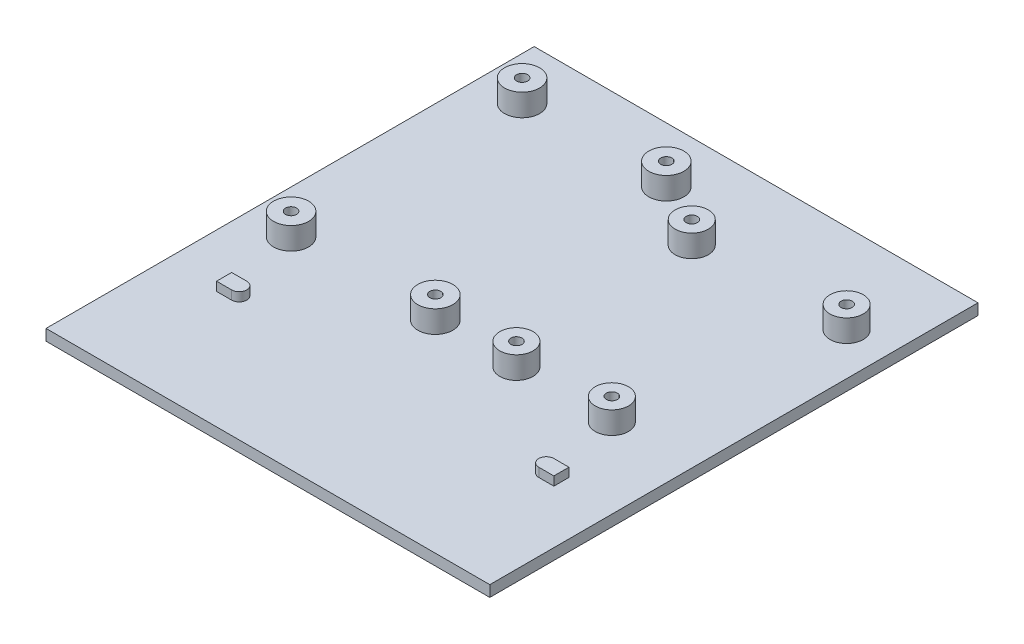
ISO-10303-21;
HEADER;
FILE_DESCRIPTION(('STEP AP214'),'2;1');
FILE_NAME('part.step','',(''),(''),'','','');
FILE_SCHEMA(('AUTOMOTIVE_DESIGN { 1 0 10303 214 1 1 1 1 }'));
ENDSEC;
DATA;
#1=APPLICATION_CONTEXT('core data for automotive mechanical design processes');
#2=APPLICATION_PROTOCOL_DEFINITION('international standard','automotive_design',2000,#1);
#3=PRODUCT_CONTEXT('',#1,'mechanical');
#4=PRODUCT('Part','Part','',(#3));
#5=PRODUCT_RELATED_PRODUCT_CATEGORY('part','',(#4));
#6=PRODUCT_DEFINITION_FORMATION('','',#4);
#7=PRODUCT_DEFINITION_CONTEXT('part definition',#1,'design');
#8=PRODUCT_DEFINITION('design','',#6,#7);
#9=PRODUCT_DEFINITION_SHAPE('','',#8);
#10=(LENGTH_UNIT() NAMED_UNIT(*) SI_UNIT(.MILLI.,.METRE.));
#11=(NAMED_UNIT(*) PLANE_ANGLE_UNIT() SI_UNIT($,.RADIAN.));
#12=(NAMED_UNIT(*) SI_UNIT($,.STERADIAN.) SOLID_ANGLE_UNIT());
#13=UNCERTAINTY_MEASURE_WITH_UNIT(LENGTH_MEASURE(1.E-05),#10,'distance_accuracy_value','');
#14=(GEOMETRIC_REPRESENTATION_CONTEXT(3) GLOBAL_UNCERTAINTY_ASSIGNED_CONTEXT((#13)) GLOBAL_UNIT_ASSIGNED_CONTEXT((#10,
#11,#12)) REPRESENTATION_CONTEXT('',''));
#15=CARTESIAN_POINT('',(0.,0.,0.));
#16=DIRECTION('',(0.,0.,1.));
#17=DIRECTION('',(1.,0.,0.));
#18=AXIS2_PLACEMENT_3D('',#15,#16,#17);
#19=CARTESIAN_POINT('',(15.24,9.525,106.1339));
#20=DIRECTION('',(0.,0.,-1.));
#21=DIRECTION('',(-1.,0.,0.));
#22=AXIS2_PLACEMENT_3D('',#19,#20,#21);
#23=PLANE('',#22);
#24=DIRECTION('',(1.,0.,0.));
#25=VECTOR('',#24,1.);
#26=CARTESIAN_POINT('',(15.24,5.715,106.1339));
#27=LINE('',#26,#25);
#28=CARTESIAN_POINT('',(15.24,5.715,106.1339));
#29=VERTEX_POINT('',#28);
#30=CARTESIAN_POINT('',(19.558,5.715,106.1339));
#31=VERTEX_POINT('',#30);
#32=EDGE_CURVE('E127',#29,#31,#27,.T.);
#33=ORIENTED_EDGE('',*,*,#32,.F.);
#34=DIRECTION('',(0.,-1.,0.));
#35=VECTOR('',#34,1.);
#36=CARTESIAN_POINT('',(15.24,9.525,106.1339));
#37=LINE('',#36,#35);
#38=CARTESIAN_POINT('',(15.24,3.175,106.1339));
#39=VERTEX_POINT('',#38);
#40=EDGE_CURVE('E150',#29,#39,#37,.T.);
#41=ORIENTED_EDGE('',*,*,#40,.T.);
#42=DIRECTION('',(1.,0.,0.));
#43=VECTOR('',#42,1.);
#44=CARTESIAN_POINT('',(15.24,3.175,106.1339));
#45=LINE('',#44,#43);
#46=CARTESIAN_POINT('',(19.558,3.175,106.1339));
#47=VERTEX_POINT('',#46);
#48=EDGE_CURVE('E446',#39,#47,#45,.T.);
#49=ORIENTED_EDGE('',*,*,#48,.T.);
#50=DIRECTION('',(0.,-1.,0.));
#51=VECTOR('',#50,1.);
#52=CARTESIAN_POINT('',(19.558,9.525,106.1339));
#53=LINE('',#52,#51);
#54=EDGE_CURVE('E146',#31,#47,#53,.T.);
#55=ORIENTED_EDGE('',*,*,#54,.F.);
#56=EDGE_LOOP('',(#33,#41,#49,#55));
#57=FACE_BOUND('',#56,.T.);
#58=ADVANCED_FACE('F37',(#57),#23,.F.);
#59=CARTESIAN_POINT('',(19.558,9.525,103.9749));
#60=DIRECTION('',(0.,-1.,0.));
#61=DIRECTION('',(0.,0.,-1.));
#62=AXIS2_PLACEMENT_3D('',#59,#60,#61);
#63=CYLINDRICAL_SURFACE('',#62,2.159);
#64=CARTESIAN_POINT('',(19.558,5.715,103.9749));
#65=DIRECTION('',(0.,1.,0.));
#66=DIRECTION('',(0.,0.,1.));
#67=AXIS2_PLACEMENT_3D('',#64,#65,#66);
#68=CIRCLE('',#67,2.159);
#69=CARTESIAN_POINT('',(19.558,5.715,101.8159));
#70=VERTEX_POINT('',#69);
#71=EDGE_CURVE('E124',#31,#70,#68,.T.);
#72=ORIENTED_EDGE('',*,*,#71,.F.);
#73=ORIENTED_EDGE('',*,*,#54,.T.);
#74=CARTESIAN_POINT('',(19.558,3.175,103.9749));
#75=DIRECTION('',(0.,1.,0.));
#76=DIRECTION('',(0.,0.,1.));
#77=AXIS2_PLACEMENT_3D('',#74,#75,#76);
#78=CIRCLE('',#77,2.159);
#79=CARTESIAN_POINT('',(19.558,3.175,101.8159));
#80=VERTEX_POINT('',#79);
#81=EDGE_CURVE('E144',#47,#80,#78,.T.);
#82=ORIENTED_EDGE('',*,*,#81,.T.);
#83=DIRECTION('',(0.,-1.,0.));
#84=VECTOR('',#83,1.);
#85=CARTESIAN_POINT('',(19.558,9.525,101.8159));
#86=LINE('',#85,#84);
#87=EDGE_CURVE('E137',#70,#80,#86,.T.);
#88=ORIENTED_EDGE('',*,*,#87,.F.);
#89=EDGE_LOOP('',(#72,#73,#82,#88));
#90=FACE_BOUND('',#89,.T.);
#91=ADVANCED_FACE('F142',(#90),#63,.T.);
#92=CARTESIAN_POINT('',(15.24,9.525,101.8159));
#93=DIRECTION('',(0.,0.,1.));
#94=DIRECTION('',(1.,0.,0.));
#95=AXIS2_PLACEMENT_3D('',#92,#93,#94);
#96=PLANE('',#95);
#97=DIRECTION('',(-1.,0.,0.));
#98=VECTOR('',#97,1.);
#99=CARTESIAN_POINT('',(19.558,5.715,101.8159));
#100=LINE('',#99,#98);
#101=CARTESIAN_POINT('',(15.24,5.715,101.8159));
#102=VERTEX_POINT('',#101);
#103=EDGE_CURVE('E52',#70,#102,#100,.T.);
#104=ORIENTED_EDGE('',*,*,#103,.F.);
#105=ORIENTED_EDGE('',*,*,#87,.T.);
#106=DIRECTION('',(-1.,0.,0.));
#107=VECTOR('',#106,1.);
#108=CARTESIAN_POINT('',(15.24,3.175,101.8159));
#109=LINE('',#108,#107);
#110=CARTESIAN_POINT('',(15.24,3.175,101.8159));
#111=VERTEX_POINT('',#110);
#112=EDGE_CURVE('E450',#80,#111,#109,.T.);
#113=ORIENTED_EDGE('',*,*,#112,.T.);
#114=DIRECTION('',(0.,-1.,0.));
#115=VECTOR('',#114,1.);
#116=CARTESIAN_POINT('',(15.24,9.525,101.8159));
#117=LINE('',#116,#115);
#118=EDGE_CURVE('E139',#102,#111,#117,.T.);
#119=ORIENTED_EDGE('',*,*,#118,.F.);
#120=EDGE_LOOP('',(#104,#105,#113,#119));
#121=FACE_BOUND('',#120,.T.);
#122=ADVANCED_FACE('F135',(#121),#96,.F.);
#123=CARTESIAN_POINT('',(15.24,9.525,106.1339));
#124=DIRECTION('',(1.,0.,0.));
#125=DIRECTION('',(0.,0.,-1.));
#126=AXIS2_PLACEMENT_3D('',#123,#124,#125);
#127=PLANE('',#126);
#128=DIRECTION('',(0.,0.,1.));
#129=VECTOR('',#128,1.);
#130=CARTESIAN_POINT('',(15.24,5.715,101.8159));
#131=LINE('',#130,#129);
#132=EDGE_CURVE('E140',#102,#29,#131,.T.);
#133=ORIENTED_EDGE('',*,*,#132,.F.);
#134=ORIENTED_EDGE('',*,*,#118,.T.);
#135=DIRECTION('',(0.,0.,1.));
#136=VECTOR('',#135,1.);
#137=CARTESIAN_POINT('',(15.24,3.175,106.1339));
#138=LINE('',#137,#136);
#139=EDGE_CURVE('E452',#111,#39,#138,.T.);
#140=ORIENTED_EDGE('',*,*,#139,.T.);
#141=ORIENTED_EDGE('',*,*,#40,.F.);
#142=EDGE_LOOP('',(#133,#134,#140,#141));
#143=FACE_BOUND('',#142,.T.);
#144=ADVANCED_FACE('F410',(#143),#127,.F.);
#145=CARTESIAN_POINT('',(0.,3.175,0.));
#146=DIRECTION('',(0.,1.,0.));
#147=DIRECTION('',(0.,0.,1.));
#148=AXIS2_PLACEMENT_3D('',#145,#146,#147);
#149=PLANE('',#148);
#150=CARTESIAN_POINT('',(12.3825,3.175,81.94675));
#151=DIRECTION('',(0.,1.,0.));
#152=DIRECTION('',(0.,0.,1.));
#153=AXIS2_PLACEMENT_3D('',#150,#151,#152);
#154=CIRCLE('',#153,5.0165);
#155=CARTESIAN_POINT('',(12.3825,3.175,86.96325));
#156=VERTEX_POINT('',#155);
#157=EDGE_CURVE('E156',#156,#156,#154,.T.);
#158=ORIENTED_EDGE('',*,*,#157,.F.);
#159=EDGE_LOOP('',(#158));
#160=FACE_BOUND('',#159,.T.);
#161=CARTESIAN_POINT('',(53.6575,3.175,81.94675));
#162=DIRECTION('',(0.,1.,0.));
#163=DIRECTION('',(0.,0.,1.));
#164=AXIS2_PLACEMENT_3D('',#161,#162,#163);
#165=CIRCLE('',#164,5.0165);
#166=CARTESIAN_POINT('',(53.6575,3.175,86.96325));
#167=VERTEX_POINT('',#166);
#168=EDGE_CURVE('E165',#167,#167,#165,.T.);
#169=ORIENTED_EDGE('',*,*,#168,.F.);
#170=EDGE_LOOP('',(#169));
#171=FACE_BOUND('',#170,.T.);
#172=CARTESIAN_POINT('',(76.835,3.175,81.915));
#173=DIRECTION('',(0.,1.,0.));
#174=DIRECTION('',(0.,0.,1.));
#175=AXIS2_PLACEMENT_3D('',#172,#173,#174);
#176=CIRCLE('',#175,4.7625);
#177=CARTESIAN_POINT('',(76.835,3.175,86.6775));
#178=VERTEX_POINT('',#177);
#179=EDGE_CURVE('E174',#178,#178,#176,.T.);
#180=ORIENTED_EDGE('',*,*,#179,.F.);
#181=EDGE_LOOP('',(#180));
#182=FACE_BOUND('',#181,.T.);
#183=CARTESIAN_POINT('',(104.14,3.175,81.915));
#184=DIRECTION('',(0.,1.,0.));
#185=DIRECTION('',(0.,0.,1.));
#186=AXIS2_PLACEMENT_3D('',#183,#184,#185);
#187=CIRCLE('',#186,4.7625);
#188=CARTESIAN_POINT('',(104.14,3.175,86.6775));
#189=VERTEX_POINT('',#188);
#190=EDGE_CURVE('E183',#189,#189,#187,.T.);
#191=ORIENTED_EDGE('',*,*,#190,.F.);
#192=EDGE_LOOP('',(#191));
#193=FACE_BOUND('',#192,.T.);
#194=CARTESIAN_POINT('',(114.935,3.175,25.527));
#195=DIRECTION('',(0.,1.,0.));
#196=DIRECTION('',(0.,0.,1.));
#197=AXIS2_PLACEMENT_3D('',#194,#195,#196);
#198=CIRCLE('',#197,4.76250000000001);
#199=CARTESIAN_POINT('',(114.935,3.175,30.2895));
#200=VERTEX_POINT('',#199);
#201=EDGE_CURVE('E192',#200,#200,#198,.T.);
#202=ORIENTED_EDGE('',*,*,#201,.F.);
#203=EDGE_LOOP('',(#202));
#204=FACE_BOUND('',#203,.T.);
#205=CARTESIAN_POINT('',(71.755,3.175,26.67));
#206=DIRECTION('',(0.,1.,0.));
#207=DIRECTION('',(0.,0.,1.));
#208=AXIS2_PLACEMENT_3D('',#205,#206,#207);
#209=CIRCLE('',#208,4.7625);
#210=CARTESIAN_POINT('',(71.755,3.175,31.4325));
#211=VERTEX_POINT('',#210);
#212=EDGE_CURVE('E201',#211,#211,#209,.T.);
#213=ORIENTED_EDGE('',*,*,#212,.F.);
#214=EDGE_LOOP('',(#213));
#215=FACE_BOUND('',#214,.T.);
#216=CARTESIAN_POINT('',(53.6575,3.175,15.84325));
#217=DIRECTION('',(0.,1.,0.));
#218=DIRECTION('',(0.,0.,1.));
#219=AXIS2_PLACEMENT_3D('',#216,#217,#218);
#220=CIRCLE('',#219,5.0165);
#221=CARTESIAN_POINT('',(53.6575,3.175,20.85975));
#222=VERTEX_POINT('',#221);
#223=EDGE_CURVE('E210',#222,#222,#220,.T.);
#224=ORIENTED_EDGE('',*,*,#223,.F.);
#225=EDGE_LOOP('',(#224));
#226=FACE_BOUND('',#225,.T.);
#227=CARTESIAN_POINT('',(12.3825,3.175,15.84325));
#228=DIRECTION('',(0.,1.,0.));
#229=DIRECTION('',(0.,0.,1.));
#230=AXIS2_PLACEMENT_3D('',#227,#228,#229);
#231=CIRCLE('',#230,5.0165);
#232=CARTESIAN_POINT('',(12.3825,3.175,20.85975));
#233=VERTEX_POINT('',#232);
#234=EDGE_CURVE('E219',#233,#233,#231,.T.);
#235=ORIENTED_EDGE('',*,*,#234,.F.);
#236=EDGE_LOOP('',(#235));
#237=FACE_BOUND('',#236,.T.);
#238=DIRECTION('',(0.,0.,1.));
#239=VECTOR('',#238,1.);
#240=CARTESIAN_POINT('',(0.,3.175,0.));
#241=LINE('',#240,#239);
#242=CARTESIAN_POINT('',(0.,3.175,0.));
#243=VERTEX_POINT('',#242);
#244=CARTESIAN_POINT('',(0.,3.175,139.7));
#245=VERTEX_POINT('',#244);
#246=EDGE_CURVE('E226',#243,#245,#241,.T.);
#247=ORIENTED_EDGE('',*,*,#246,.T.);
#248=DIRECTION('',(1.,0.,0.));
#249=VECTOR('',#248,1.);
#250=CARTESIAN_POINT('',(0.,3.175,139.7));
#251=LINE('',#250,#249);
#252=CARTESIAN_POINT('',(127.,3.175,139.7));
#253=VERTEX_POINT('',#252);
#254=EDGE_CURVE('E229',#245,#253,#251,.T.);
#255=ORIENTED_EDGE('',*,*,#254,.T.);
#256=DIRECTION('',(0.,0.,1.));
#257=VECTOR('',#256,1.);
#258=CARTESIAN_POINT('',(127.,3.175,0.));
#259=LINE('',#258,#257);
#260=CARTESIAN_POINT('',(127.,3.175,0.));
#261=VERTEX_POINT('',#260);
#262=EDGE_CURVE('E232',#261,#253,#259,.T.);
#263=ORIENTED_EDGE('',*,*,#262,.F.);
#264=DIRECTION('',(1.,0.,0.));
#265=VECTOR('',#264,1.);
#266=CARTESIAN_POINT('',(0.,3.175,0.));
#267=LINE('',#266,#265);
#268=EDGE_CURVE('E235',#243,#261,#267,.T.);
#269=ORIENTED_EDGE('',*,*,#268,.F.);
#270=EDGE_LOOP('',(#247,#255,#263,#269));
#271=FACE_BOUND('',#270,.T.);
#272=ORIENTED_EDGE('',*,*,#81,.F.);
#273=ORIENTED_EDGE('',*,*,#48,.F.);
#274=ORIENTED_EDGE('',*,*,#139,.F.);
#275=ORIENTED_EDGE('',*,*,#112,.F.);
#276=EDGE_LOOP('',(#272,#273,#274,#275));
#277=FACE_BOUND('',#276,.T.);
#278=DIRECTION('',(1.,0.,0.));
#279=VECTOR('',#278,1.);
#280=CARTESIAN_POINT('',(111.76,3.175,106.1339));
#281=LINE('',#280,#279);
#282=CARTESIAN_POINT('',(107.442,3.175,106.1339));
#283=VERTEX_POINT('',#282);
#284=CARTESIAN_POINT('',(111.76,3.175,106.1339));
#285=VERTEX_POINT('',#284);
#286=EDGE_CURVE('E422',#283,#285,#281,.T.);
#287=ORIENTED_EDGE('',*,*,#286,.F.);
#288=CARTESIAN_POINT('',(107.442,3.175,103.9749));
#289=DIRECTION('',(0.,1.,0.));
#290=DIRECTION('',(0.,0.,1.));
#291=AXIS2_PLACEMENT_3D('',#288,#289,#290);
#292=CIRCLE('',#291,2.159);
#293=CARTESIAN_POINT('',(107.442,3.175,101.8159));
#294=VERTEX_POINT('',#293);
#295=EDGE_CURVE('E425',#294,#283,#292,.T.);
#296=ORIENTED_EDGE('',*,*,#295,.F.);
#297=DIRECTION('',(-1.,0.,0.));
#298=VECTOR('',#297,1.);
#299=CARTESIAN_POINT('',(107.442,3.175,101.8159));
#300=LINE('',#299,#298);
#301=CARTESIAN_POINT('',(111.76,3.175,101.8159));
#302=VERTEX_POINT('',#301);
#303=EDGE_CURVE('E431',#302,#294,#300,.T.);
#304=ORIENTED_EDGE('',*,*,#303,.F.);
#305=DIRECTION('',(0.,0.,-1.));
#306=VECTOR('',#305,1.);
#307=CARTESIAN_POINT('',(111.76,3.175,101.8159));
#308=LINE('',#307,#306);
#309=EDGE_CURVE('E427',#285,#302,#308,.T.);
#310=ORIENTED_EDGE('',*,*,#309,.F.);
#311=EDGE_LOOP('',(#287,#296,#304,#310));
#312=FACE_BOUND('',#311,.T.);
#313=ADVANCED_FACE('F295',(#160,#171,#182,#193,#204,#215,#226,#237,#271,#277,#312),#149,.T.);
#314=CARTESIAN_POINT('',(0.,3.175,0.));
#315=DIRECTION('',(1.,0.,0.));
#316=DIRECTION('',(0.,0.,-1.));
#317=AXIS2_PLACEMENT_3D('',#314,#315,#316);
#318=PLANE('',#317);
#319=DIRECTION('',(0.,0.,1.));
#320=VECTOR('',#319,1.);
#321=CARTESIAN_POINT('',(0.,0.,0.));
#322=LINE('',#321,#320);
#323=CARTESIAN_POINT('',(0.,0.,0.));
#324=VERTEX_POINT('',#323);
#325=CARTESIAN_POINT('',(0.,0.,139.7));
#326=VERTEX_POINT('',#325);
#327=EDGE_CURVE('E223',#324,#326,#322,.T.);
#328=ORIENTED_EDGE('',*,*,#327,.T.);
#329=DIRECTION('',(0.,-1.,0.));
#330=VECTOR('',#329,1.);
#331=CARTESIAN_POINT('',(0.,3.175,139.7));
#332=LINE('',#331,#330);
#333=EDGE_CURVE('E254',#245,#326,#332,.T.);
#334=ORIENTED_EDGE('',*,*,#333,.F.);
#335=ORIENTED_EDGE('',*,*,#246,.F.);
#336=DIRECTION('',(0.,-1.,0.));
#337=VECTOR('',#336,1.);
#338=CARTESIAN_POINT('',(0.,3.175,0.));
#339=LINE('',#338,#337);
#340=EDGE_CURVE('E238',#243,#324,#339,.T.);
#341=ORIENTED_EDGE('',*,*,#340,.T.);
#342=EDGE_LOOP('',(#328,#334,#335,#341));
#343=FACE_BOUND('',#342,.T.);
#344=ADVANCED_FACE('F39',(#343),#318,.F.);
#345=CARTESIAN_POINT('',(0.,3.175,139.7));
#346=DIRECTION('',(0.,0.,-1.));
#347=DIRECTION('',(-1.,0.,0.));
#348=AXIS2_PLACEMENT_3D('',#345,#346,#347);
#349=PLANE('',#348);
#350=DIRECTION('',(1.,0.,0.));
#351=VECTOR('',#350,1.);
#352=CARTESIAN_POINT('',(0.,0.,139.7));
#353=LINE('',#352,#351);
#354=CARTESIAN_POINT('',(127.,0.,139.7));
#355=VERTEX_POINT('',#354);
#356=EDGE_CURVE('E241',#326,#355,#353,.T.);
#357=ORIENTED_EDGE('',*,*,#356,.T.);
#358=DIRECTION('',(0.,-1.,0.));
#359=VECTOR('',#358,1.);
#360=CARTESIAN_POINT('',(127.,3.175,139.7));
#361=LINE('',#360,#359);
#362=EDGE_CURVE('E252',#253,#355,#361,.T.);
#363=ORIENTED_EDGE('',*,*,#362,.F.);
#364=ORIENTED_EDGE('',*,*,#254,.F.);
#365=ORIENTED_EDGE('',*,*,#333,.T.);
#366=EDGE_LOOP('',(#357,#363,#364,#365));
#367=FACE_BOUND('',#366,.T.);
#368=ADVANCED_FACE('F507',(#367),#349,.F.);
#369=CARTESIAN_POINT('',(127.,3.175,0.));
#370=DIRECTION('',(1.,0.,0.));
#371=DIRECTION('',(0.,0.,-1.));
#372=AXIS2_PLACEMENT_3D('',#369,#370,#371);
#373=PLANE('',#372);
#374=DIRECTION('',(0.,0.,1.));
#375=VECTOR('',#374,1.);
#376=CARTESIAN_POINT('',(127.,0.,0.));
#377=LINE('',#376,#375);
#378=CARTESIAN_POINT('',(127.,0.,0.));
#379=VERTEX_POINT('',#378);
#380=EDGE_CURVE('E244',#379,#355,#377,.T.);
#381=ORIENTED_EDGE('',*,*,#380,.F.);
#382=DIRECTION('',(0.,-1.,0.));
#383=VECTOR('',#382,1.);
#384=CARTESIAN_POINT('',(127.,3.175,0.));
#385=LINE('',#384,#383);
#386=EDGE_CURVE('E250',#261,#379,#385,.T.);
#387=ORIENTED_EDGE('',*,*,#386,.F.);
#388=ORIENTED_EDGE('',*,*,#262,.T.);
#389=ORIENTED_EDGE('',*,*,#362,.T.);
#390=EDGE_LOOP('',(#381,#387,#388,#389));
#391=FACE_BOUND('',#390,.T.);
#392=ADVANCED_FACE('F514',(#391),#373,.T.);
#393=CARTESIAN_POINT('',(0.,3.175,0.));
#394=DIRECTION('',(0.,0.,-1.));
#395=DIRECTION('',(-1.,0.,0.));
#396=AXIS2_PLACEMENT_3D('',#393,#394,#395);
#397=PLANE('',#396);
#398=DIRECTION('',(1.,0.,0.));
#399=VECTOR('',#398,1.);
#400=CARTESIAN_POINT('',(0.,0.,0.));
#401=LINE('',#400,#399);
#402=EDGE_CURVE('E230',#324,#379,#401,.T.);
#403=ORIENTED_EDGE('',*,*,#402,.F.);
#404=ORIENTED_EDGE('',*,*,#340,.F.);
#405=ORIENTED_EDGE('',*,*,#268,.T.);
#406=ORIENTED_EDGE('',*,*,#386,.T.);
#407=EDGE_LOOP('',(#403,#404,#405,#406));
#408=FACE_BOUND('',#407,.T.);
#409=ADVANCED_FACE('F521',(#408),#397,.T.);
#410=CARTESIAN_POINT('',(0.,0.,0.));
#411=DIRECTION('',(0.,1.,0.));
#412=DIRECTION('',(0.,0.,1.));
#413=AXIS2_PLACEMENT_3D('',#410,#411,#412);
#414=PLANE('',#413);
#415=ORIENTED_EDGE('',*,*,#327,.F.);
#416=ORIENTED_EDGE('',*,*,#402,.T.);
#417=ORIENTED_EDGE('',*,*,#380,.T.);
#418=ORIENTED_EDGE('',*,*,#356,.F.);
#419=EDGE_LOOP('',(#415,#416,#417,#418));
#420=FACE_BOUND('',#419,.T.);
#421=ADVANCED_FACE('F398',(#420),#414,.F.);
#422=CARTESIAN_POINT('',(12.3825,9.525,15.84325));
#423=DIRECTION('',(0.,1.,0.));
#424=DIRECTION('',(0.,0.,1.));
#425=AXIS2_PLACEMENT_3D('',#422,#423,#424);
#426=PLANE('',#425);
#427=CARTESIAN_POINT('',(12.3825,9.525,15.84325));
#428=DIRECTION('',(0.,1.,0.));
#429=DIRECTION('',(0.,0.,1.));
#430=AXIS2_PLACEMENT_3D('',#427,#428,#429);
#431=CIRCLE('',#430,5.0165);
#432=CARTESIAN_POINT('',(12.3825,9.525,20.85975));
#433=VERTEX_POINT('',#432);
#434=EDGE_CURVE('E220',#433,#433,#431,.T.);
#435=ORIENTED_EDGE('',*,*,#434,.T.);
#436=EDGE_LOOP('',(#435));
#437=FACE_BOUND('',#436,.T.);
#438=CARTESIAN_POINT('',(12.3825,9.525,15.84325));
#439=DIRECTION('',(0.,1.,0.));
#440=DIRECTION('',(0.,0.,1.));
#441=AXIS2_PLACEMENT_3D('',#438,#439,#440);
#442=CIRCLE('',#441,1.5875);
#443=CARTESIAN_POINT('',(12.3825,9.525,17.43075));
#444=VERTEX_POINT('',#443);
#445=EDGE_CURVE('E214',#444,#444,#442,.T.);
#446=ORIENTED_EDGE('',*,*,#445,.F.);
#447=EDGE_LOOP('',(#446));
#448=FACE_BOUND('',#447,.T.);
#449=ADVANCED_FACE('F396',(#437,#448),#426,.T.);
#450=CARTESIAN_POINT('',(12.3825,9.525,15.84325));
#451=DIRECTION('',(0.,-1.,0.));
#452=DIRECTION('',(0.,0.,-1.));
#453=AXIS2_PLACEMENT_3D('',#450,#451,#452);
#454=CYLINDRICAL_SURFACE('',#453,5.0165);
#455=ORIENTED_EDGE('',*,*,#434,.F.);
#456=EDGE_LOOP('',(#455));
#457=FACE_BOUND('',#456,.T.);
#458=ORIENTED_EDGE('',*,*,#234,.T.);
#459=EDGE_LOOP('',(#458));
#460=FACE_BOUND('',#459,.T.);
#461=ADVANCED_FACE('F394',(#457,#460),#454,.T.);
#462=CARTESIAN_POINT('',(12.3825,9.525,15.84325));
#463=DIRECTION('',(0.,-1.,0.));
#464=DIRECTION('',(0.,0.,-1.));
#465=AXIS2_PLACEMENT_3D('',#462,#463,#464);
#466=CYLINDRICAL_SURFACE('',#465,1.5875);
#467=ORIENTED_EDGE('',*,*,#445,.T.);
#468=EDGE_LOOP('',(#467));
#469=FACE_BOUND('',#468,.T.);
#470=CARTESIAN_POINT('',(12.3825,3.175,15.84325));
#471=DIRECTION('',(0.,1.,0.));
#472=DIRECTION('',(0.,0.,1.));
#473=AXIS2_PLACEMENT_3D('',#470,#471,#472);
#474=CIRCLE('',#473,1.5875);
#475=CARTESIAN_POINT('',(12.3825,3.175,17.43075));
#476=VERTEX_POINT('',#475);
#477=EDGE_CURVE('E257',#476,#476,#474,.F.);
#478=ORIENTED_EDGE('',*,*,#477,.T.);
#479=EDGE_LOOP('',(#478));
#480=FACE_BOUND('',#479,.T.);
#481=ADVANCED_FACE('F391',(#469,#480),#466,.F.);
#482=ORIENTED_EDGE('',*,*,#477,.F.);
#483=EDGE_LOOP('',(#482));
#484=FACE_BOUND('',#483,.T.);
#485=ADVANCED_FACE('F386',(#484),#149,.T.);
#486=CARTESIAN_POINT('',(53.6575,9.525,15.84325));
#487=DIRECTION('',(0.,1.,0.));
#488=DIRECTION('',(0.,0.,1.));
#489=AXIS2_PLACEMENT_3D('',#486,#487,#488);
#490=PLANE('',#489);
#491=CARTESIAN_POINT('',(53.6575,9.525,15.84325));
#492=DIRECTION('',(0.,1.,0.));
#493=DIRECTION('',(0.,0.,1.));
#494=AXIS2_PLACEMENT_3D('',#491,#492,#493);
#495=CIRCLE('',#494,5.0165);
#496=CARTESIAN_POINT('',(53.6575,9.525,20.85975));
#497=VERTEX_POINT('',#496);
#498=EDGE_CURVE('E211',#497,#497,#495,.T.);
#499=ORIENTED_EDGE('',*,*,#498,.T.);
#500=EDGE_LOOP('',(#499));
#501=FACE_BOUND('',#500,.T.);
#502=CARTESIAN_POINT('',(53.6575,9.525,15.84325));
#503=DIRECTION('',(0.,1.,0.));
#504=DIRECTION('',(0.,0.,1.));
#505=AXIS2_PLACEMENT_3D('',#502,#503,#504);
#506=CIRCLE('',#505,1.5875);
#507=CARTESIAN_POINT('',(53.6575,9.525,17.43075));
#508=VERTEX_POINT('',#507);
#509=EDGE_CURVE('E205',#508,#508,#506,.T.);
#510=ORIENTED_EDGE('',*,*,#509,.F.);
#511=EDGE_LOOP('',(#510));
#512=FACE_BOUND('',#511,.T.);
#513=ADVANCED_FACE('F383',(#501,#512),#490,.T.);
#514=CARTESIAN_POINT('',(53.6575,9.525,15.84325));
#515=DIRECTION('',(0.,-1.,0.));
#516=DIRECTION('',(0.,0.,-1.));
#517=AXIS2_PLACEMENT_3D('',#514,#515,#516);
#518=CYLINDRICAL_SURFACE('',#517,5.0165);
#519=ORIENTED_EDGE('',*,*,#498,.F.);
#520=EDGE_LOOP('',(#519));
#521=FACE_BOUND('',#520,.T.);
#522=ORIENTED_EDGE('',*,*,#223,.T.);
#523=EDGE_LOOP('',(#522));
#524=FACE_BOUND('',#523,.T.);
#525=ADVANCED_FACE('F381',(#521,#524),#518,.T.);
#526=CARTESIAN_POINT('',(53.6575,9.525,15.84325));
#527=DIRECTION('',(0.,-1.,0.));
#528=DIRECTION('',(0.,0.,-1.));
#529=AXIS2_PLACEMENT_3D('',#526,#527,#528);
#530=CYLINDRICAL_SURFACE('',#529,1.5875);
#531=ORIENTED_EDGE('',*,*,#509,.T.);
#532=EDGE_LOOP('',(#531));
#533=FACE_BOUND('',#532,.T.);
#534=CARTESIAN_POINT('',(53.6575,3.175,15.84325));
#535=DIRECTION('',(0.,1.,0.));
#536=DIRECTION('',(0.,0.,1.));
#537=AXIS2_PLACEMENT_3D('',#534,#535,#536);
#538=CIRCLE('',#537,1.5875);
#539=CARTESIAN_POINT('',(53.6575,3.175,17.43075));
#540=VERTEX_POINT('',#539);
#541=EDGE_CURVE('E260',#540,#540,#538,.F.);
#542=ORIENTED_EDGE('',*,*,#541,.T.);
#543=EDGE_LOOP('',(#542));
#544=FACE_BOUND('',#543,.T.);
#545=ADVANCED_FACE('F378',(#533,#544),#530,.F.);
#546=ORIENTED_EDGE('',*,*,#541,.F.);
#547=EDGE_LOOP('',(#546));
#548=FACE_BOUND('',#547,.T.);
#549=ADVANCED_FACE('F373',(#548),#149,.T.);
#550=CARTESIAN_POINT('',(71.755,9.525,26.67));
#551=DIRECTION('',(0.,1.,0.));
#552=DIRECTION('',(0.,0.,1.));
#553=AXIS2_PLACEMENT_3D('',#550,#551,#552);
#554=PLANE('',#553);
#555=CARTESIAN_POINT('',(71.755,9.525,26.67));
#556=DIRECTION('',(0.,1.,0.));
#557=DIRECTION('',(0.,0.,1.));
#558=AXIS2_PLACEMENT_3D('',#555,#556,#557);
#559=CIRCLE('',#558,4.7625);
#560=CARTESIAN_POINT('',(71.755,9.525,31.4325));
#561=VERTEX_POINT('',#560);
#562=EDGE_CURVE('E202',#561,#561,#559,.T.);
#563=ORIENTED_EDGE('',*,*,#562,.T.);
#564=EDGE_LOOP('',(#563));
#565=FACE_BOUND('',#564,.T.);
#566=CARTESIAN_POINT('',(71.755,9.525,26.67));
#567=DIRECTION('',(0.,1.,0.));
#568=DIRECTION('',(0.,0.,1.));
#569=AXIS2_PLACEMENT_3D('',#566,#567,#568);
#570=CIRCLE('',#569,1.58750000000001);
#571=CARTESIAN_POINT('',(71.755,9.525,28.2575));
#572=VERTEX_POINT('',#571);
#573=EDGE_CURVE('E196',#572,#572,#570,.T.);
#574=ORIENTED_EDGE('',*,*,#573,.F.);
#575=EDGE_LOOP('',(#574));
#576=FACE_BOUND('',#575,.T.);
#577=ADVANCED_FACE('F370',(#565,#576),#554,.T.);
#578=CARTESIAN_POINT('',(71.755,9.525,26.67));
#579=DIRECTION('',(0.,-1.,0.));
#580=DIRECTION('',(0.,0.,-1.));
#581=AXIS2_PLACEMENT_3D('',#578,#579,#580);
#582=CYLINDRICAL_SURFACE('',#581,4.7625);
#583=ORIENTED_EDGE('',*,*,#562,.F.);
#584=EDGE_LOOP('',(#583));
#585=FACE_BOUND('',#584,.T.);
#586=ORIENTED_EDGE('',*,*,#212,.T.);
#587=EDGE_LOOP('',(#586));
#588=FACE_BOUND('',#587,.T.);
#589=ADVANCED_FACE('F368',(#585,#588),#582,.T.);
#590=CARTESIAN_POINT('',(71.755,9.525,26.67));
#591=DIRECTION('',(0.,-1.,0.));
#592=DIRECTION('',(0.,0.,-1.));
#593=AXIS2_PLACEMENT_3D('',#590,#591,#592);
#594=CYLINDRICAL_SURFACE('',#593,1.58750000000001);
#595=ORIENTED_EDGE('',*,*,#573,.T.);
#596=EDGE_LOOP('',(#595));
#597=FACE_BOUND('',#596,.T.);
#598=CARTESIAN_POINT('',(71.755,3.175,26.67));
#599=DIRECTION('',(0.,1.,0.));
#600=DIRECTION('',(0.,0.,1.));
#601=AXIS2_PLACEMENT_3D('',#598,#599,#600);
#602=CIRCLE('',#601,1.58750000000001);
#603=CARTESIAN_POINT('',(71.755,3.175,28.2575));
#604=VERTEX_POINT('',#603);
#605=EDGE_CURVE('E263',#604,#604,#602,.F.);
#606=ORIENTED_EDGE('',*,*,#605,.T.);
#607=EDGE_LOOP('',(#606));
#608=FACE_BOUND('',#607,.T.);
#609=ADVANCED_FACE('F365',(#597,#608),#594,.F.);
#610=ORIENTED_EDGE('',*,*,#605,.F.);
#611=EDGE_LOOP('',(#610));
#612=FACE_BOUND('',#611,.T.);
#613=ADVANCED_FACE('F360',(#612),#149,.T.);
#614=CARTESIAN_POINT('',(114.935,9.525,25.527));
#615=DIRECTION('',(0.,1.,0.));
#616=DIRECTION('',(0.,0.,1.));
#617=AXIS2_PLACEMENT_3D('',#614,#615,#616);
#618=PLANE('',#617);
#619=CARTESIAN_POINT('',(114.935,9.525,25.527));
#620=DIRECTION('',(0.,1.,0.));
#621=DIRECTION('',(0.,0.,1.));
#622=AXIS2_PLACEMENT_3D('',#619,#620,#621);
#623=CIRCLE('',#622,4.76250000000001);
#624=CARTESIAN_POINT('',(114.935,9.525,30.2895));
#625=VERTEX_POINT('',#624);
#626=EDGE_CURVE('E193',#625,#625,#623,.T.);
#627=ORIENTED_EDGE('',*,*,#626,.T.);
#628=EDGE_LOOP('',(#627));
#629=FACE_BOUND('',#628,.T.);
#630=CARTESIAN_POINT('',(114.935,9.525,25.527));
#631=DIRECTION('',(0.,1.,0.));
#632=DIRECTION('',(0.,0.,1.));
#633=AXIS2_PLACEMENT_3D('',#630,#631,#632);
#634=CIRCLE('',#633,1.5875);
#635=CARTESIAN_POINT('',(114.935,9.525,27.1145));
#636=VERTEX_POINT('',#635);
#637=EDGE_CURVE('E187',#636,#636,#634,.T.);
#638=ORIENTED_EDGE('',*,*,#637,.F.);
#639=EDGE_LOOP('',(#638));
#640=FACE_BOUND('',#639,.T.);
#641=ADVANCED_FACE('F357',(#629,#640),#618,.T.);
#642=CARTESIAN_POINT('',(114.935,9.525,25.527));
#643=DIRECTION('',(0.,-1.,0.));
#644=DIRECTION('',(0.,0.,-1.));
#645=AXIS2_PLACEMENT_3D('',#642,#643,#644);
#646=CYLINDRICAL_SURFACE('',#645,4.76250000000001);
#647=ORIENTED_EDGE('',*,*,#626,.F.);
#648=EDGE_LOOP('',(#647));
#649=FACE_BOUND('',#648,.T.);
#650=ORIENTED_EDGE('',*,*,#201,.T.);
#651=EDGE_LOOP('',(#650));
#652=FACE_BOUND('',#651,.T.);
#653=ADVANCED_FACE('F355',(#649,#652),#646,.T.);
#654=CARTESIAN_POINT('',(114.935,9.525,25.527));
#655=DIRECTION('',(0.,-1.,0.));
#656=DIRECTION('',(0.,0.,-1.));
#657=AXIS2_PLACEMENT_3D('',#654,#655,#656);
#658=CYLINDRICAL_SURFACE('',#657,1.5875);
#659=ORIENTED_EDGE('',*,*,#637,.T.);
#660=EDGE_LOOP('',(#659));
#661=FACE_BOUND('',#660,.T.);
#662=CARTESIAN_POINT('',(114.935,3.175,25.527));
#663=DIRECTION('',(0.,1.,0.));
#664=DIRECTION('',(0.,0.,1.));
#665=AXIS2_PLACEMENT_3D('',#662,#663,#664);
#666=CIRCLE('',#665,1.5875);
#667=CARTESIAN_POINT('',(114.935,3.175,27.1145));
#668=VERTEX_POINT('',#667);
#669=EDGE_CURVE('E266',#668,#668,#666,.F.);
#670=ORIENTED_EDGE('',*,*,#669,.T.);
#671=EDGE_LOOP('',(#670));
#672=FACE_BOUND('',#671,.T.);
#673=ADVANCED_FACE('F352',(#661,#672),#658,.F.);
#674=ORIENTED_EDGE('',*,*,#669,.F.);
#675=EDGE_LOOP('',(#674));
#676=FACE_BOUND('',#675,.T.);
#677=ADVANCED_FACE('F347',(#676),#149,.T.);
#678=CARTESIAN_POINT('',(104.14,9.525,81.915));
#679=DIRECTION('',(0.,1.,0.));
#680=DIRECTION('',(0.,0.,1.));
#681=AXIS2_PLACEMENT_3D('',#678,#679,#680);
#682=PLANE('',#681);
#683=CARTESIAN_POINT('',(104.14,9.525,81.915));
#684=DIRECTION('',(0.,1.,0.));
#685=DIRECTION('',(0.,0.,1.));
#686=AXIS2_PLACEMENT_3D('',#683,#684,#685);
#687=CIRCLE('',#686,4.7625);
#688=CARTESIAN_POINT('',(104.14,9.525,86.6775));
#689=VERTEX_POINT('',#688);
#690=EDGE_CURVE('E184',#689,#689,#687,.T.);
#691=ORIENTED_EDGE('',*,*,#690,.T.);
#692=EDGE_LOOP('',(#691));
#693=FACE_BOUND('',#692,.T.);
#694=CARTESIAN_POINT('',(104.14,9.525,81.915));
#695=DIRECTION('',(0.,1.,0.));
#696=DIRECTION('',(0.,0.,1.));
#697=AXIS2_PLACEMENT_3D('',#694,#695,#696);
#698=CIRCLE('',#697,1.5875);
#699=CARTESIAN_POINT('',(104.14,9.525,83.5025));
#700=VERTEX_POINT('',#699);
#701=EDGE_CURVE('E178',#700,#700,#698,.T.);
#702=ORIENTED_EDGE('',*,*,#701,.F.);
#703=EDGE_LOOP('',(#702));
#704=FACE_BOUND('',#703,.T.);
#705=ADVANCED_FACE('F344',(#693,#704),#682,.T.);
#706=CARTESIAN_POINT('',(104.14,9.525,81.915));
#707=DIRECTION('',(0.,-1.,0.));
#708=DIRECTION('',(0.,0.,-1.));
#709=AXIS2_PLACEMENT_3D('',#706,#707,#708);
#710=CYLINDRICAL_SURFACE('',#709,4.7625);
#711=ORIENTED_EDGE('',*,*,#690,.F.);
#712=EDGE_LOOP('',(#711));
#713=FACE_BOUND('',#712,.T.);
#714=ORIENTED_EDGE('',*,*,#190,.T.);
#715=EDGE_LOOP('',(#714));
#716=FACE_BOUND('',#715,.T.);
#717=ADVANCED_FACE('F342',(#713,#716),#710,.T.);
#718=CARTESIAN_POINT('',(104.14,9.525,81.915));
#719=DIRECTION('',(0.,-1.,0.));
#720=DIRECTION('',(0.,0.,-1.));
#721=AXIS2_PLACEMENT_3D('',#718,#719,#720);
#722=CYLINDRICAL_SURFACE('',#721,1.5875);
#723=ORIENTED_EDGE('',*,*,#701,.T.);
#724=EDGE_LOOP('',(#723));
#725=FACE_BOUND('',#724,.T.);
#726=CARTESIAN_POINT('',(104.14,3.175,81.915));
#727=DIRECTION('',(0.,1.,0.));
#728=DIRECTION('',(0.,0.,1.));
#729=AXIS2_PLACEMENT_3D('',#726,#727,#728);
#730=CIRCLE('',#729,1.5875);
#731=CARTESIAN_POINT('',(104.14,3.175,83.5025));
#732=VERTEX_POINT('',#731);
#733=EDGE_CURVE('E269',#732,#732,#730,.F.);
#734=ORIENTED_EDGE('',*,*,#733,.T.);
#735=EDGE_LOOP('',(#734));
#736=FACE_BOUND('',#735,.T.);
#737=ADVANCED_FACE('F339',(#725,#736),#722,.F.);
#738=ORIENTED_EDGE('',*,*,#733,.F.);
#739=EDGE_LOOP('',(#738));
#740=FACE_BOUND('',#739,.T.);
#741=ADVANCED_FACE('F302',(#740),#149,.T.);
#742=CARTESIAN_POINT('',(76.835,9.525,81.915));
#743=DIRECTION('',(0.,1.,0.));
#744=DIRECTION('',(0.,0.,1.));
#745=AXIS2_PLACEMENT_3D('',#742,#743,#744);
#746=PLANE('',#745);
#747=CARTESIAN_POINT('',(76.835,9.525,81.915));
#748=DIRECTION('',(0.,1.,0.));
#749=DIRECTION('',(0.,0.,1.));
#750=AXIS2_PLACEMENT_3D('',#747,#748,#749);
#751=CIRCLE('',#750,4.7625);
#752=CARTESIAN_POINT('',(76.835,9.525,86.6775));
#753=VERTEX_POINT('',#752);
#754=EDGE_CURVE('E175',#753,#753,#751,.T.);
#755=ORIENTED_EDGE('',*,*,#754,.T.);
#756=EDGE_LOOP('',(#755));
#757=FACE_BOUND('',#756,.T.);
#758=CARTESIAN_POINT('',(76.835,9.525,81.915));
#759=DIRECTION('',(0.,1.,0.));
#760=DIRECTION('',(0.,0.,1.));
#761=AXIS2_PLACEMENT_3D('',#758,#759,#760);
#762=CIRCLE('',#761,1.5875);
#763=CARTESIAN_POINT('',(76.835,9.525,83.5025));
#764=VERTEX_POINT('',#763);
#765=EDGE_CURVE('E169',#764,#764,#762,.T.);
#766=ORIENTED_EDGE('',*,*,#765,.F.);
#767=EDGE_LOOP('',(#766));
#768=FACE_BOUND('',#767,.T.);
#769=ADVANCED_FACE('F332',(#757,#768),#746,.T.);
#770=CARTESIAN_POINT('',(76.835,9.525,81.915));
#771=DIRECTION('',(0.,-1.,0.));
#772=DIRECTION('',(0.,0.,-1.));
#773=AXIS2_PLACEMENT_3D('',#770,#771,#772);
#774=CYLINDRICAL_SURFACE('',#773,4.7625);
#775=ORIENTED_EDGE('',*,*,#754,.F.);
#776=EDGE_LOOP('',(#775));
#777=FACE_BOUND('',#776,.T.);
#778=ORIENTED_EDGE('',*,*,#179,.T.);
#779=EDGE_LOOP('',(#778));
#780=FACE_BOUND('',#779,.T.);
#781=ADVANCED_FACE('F330',(#777,#780),#774,.T.);
#782=CARTESIAN_POINT('',(76.835,9.525,81.915));
#783=DIRECTION('',(0.,-1.,0.));
#784=DIRECTION('',(0.,0.,-1.));
#785=AXIS2_PLACEMENT_3D('',#782,#783,#784);
#786=CYLINDRICAL_SURFACE('',#785,1.5875);
#787=ORIENTED_EDGE('',*,*,#765,.T.);
#788=EDGE_LOOP('',(#787));
#789=FACE_BOUND('',#788,.T.);
#790=CARTESIAN_POINT('',(76.835,3.175,81.915));
#791=DIRECTION('',(0.,1.,0.));
#792=DIRECTION('',(0.,0.,1.));
#793=AXIS2_PLACEMENT_3D('',#790,#791,#792);
#794=CIRCLE('',#793,1.5875);
#795=CARTESIAN_POINT('',(76.835,3.175,83.5025));
#796=VERTEX_POINT('',#795);
#797=EDGE_CURVE('E272',#796,#796,#794,.F.);
#798=ORIENTED_EDGE('',*,*,#797,.T.);
#799=EDGE_LOOP('',(#798));
#800=FACE_BOUND('',#799,.T.);
#801=ADVANCED_FACE('F300',(#789,#800),#786,.F.);
#802=ORIENTED_EDGE('',*,*,#797,.F.);
#803=EDGE_LOOP('',(#802));
#804=FACE_BOUND('',#803,.T.);
#805=ADVANCED_FACE('F283',(#804),#149,.T.);
#806=CARTESIAN_POINT('',(53.6575,9.525,81.94675));
#807=DIRECTION('',(0.,1.,0.));
#808=DIRECTION('',(0.,0.,1.));
#809=AXIS2_PLACEMENT_3D('',#806,#807,#808);
#810=PLANE('',#809);
#811=CARTESIAN_POINT('',(53.6575,9.525,81.94675));
#812=DIRECTION('',(0.,1.,0.));
#813=DIRECTION('',(0.,0.,1.));
#814=AXIS2_PLACEMENT_3D('',#811,#812,#813);
#815=CIRCLE('',#814,5.0165);
#816=CARTESIAN_POINT('',(53.6575,9.525,86.96325));
#817=VERTEX_POINT('',#816);
#818=EDGE_CURVE('E166',#817,#817,#815,.T.);
#819=ORIENTED_EDGE('',*,*,#818,.T.);
#820=EDGE_LOOP('',(#819));
#821=FACE_BOUND('',#820,.T.);
#822=CARTESIAN_POINT('',(53.6575,9.525,81.94675));
#823=DIRECTION('',(0.,1.,0.));
#824=DIRECTION('',(0.,0.,1.));
#825=AXIS2_PLACEMENT_3D('',#822,#823,#824);
#826=CIRCLE('',#825,1.5875);
#827=CARTESIAN_POINT('',(53.6575,9.525,83.53425));
#828=VERTEX_POINT('',#827);
#829=EDGE_CURVE('E160',#828,#828,#826,.T.);
#830=ORIENTED_EDGE('',*,*,#829,.F.);
#831=EDGE_LOOP('',(#830));
#832=FACE_BOUND('',#831,.T.);
#833=ADVANCED_FACE('F299',(#821,#832),#810,.T.);
#834=CARTESIAN_POINT('',(53.6575,9.525,81.94675));
#835=DIRECTION('',(0.,-1.,0.));
#836=DIRECTION('',(0.,0.,-1.));
#837=AXIS2_PLACEMENT_3D('',#834,#835,#836);
#838=CYLINDRICAL_SURFACE('',#837,5.0165);
#839=ORIENTED_EDGE('',*,*,#818,.F.);
#840=EDGE_LOOP('',(#839));
#841=FACE_BOUND('',#840,.T.);
#842=ORIENTED_EDGE('',*,*,#168,.T.);
#843=EDGE_LOOP('',(#842));
#844=FACE_BOUND('',#843,.T.);
#845=ADVANCED_FACE('F292',(#841,#844),#838,.T.);
#846=CARTESIAN_POINT('',(53.6575,9.525,81.94675));
#847=DIRECTION('',(0.,-1.,0.));
#848=DIRECTION('',(0.,0.,-1.));
#849=AXIS2_PLACEMENT_3D('',#846,#847,#848);
#850=CYLINDRICAL_SURFACE('',#849,1.5875);
#851=ORIENTED_EDGE('',*,*,#829,.T.);
#852=EDGE_LOOP('',(#851));
#853=FACE_BOUND('',#852,.T.);
#854=CARTESIAN_POINT('',(53.6575,3.175,81.94675));
#855=DIRECTION('',(0.,1.,0.));
#856=DIRECTION('',(0.,0.,1.));
#857=AXIS2_PLACEMENT_3D('',#854,#855,#856);
#858=CIRCLE('',#857,1.5875);
#859=CARTESIAN_POINT('',(53.6575,3.175,83.53425));
#860=VERTEX_POINT('',#859);
#861=EDGE_CURVE('E45',#860,#860,#858,.F.);
#862=ORIENTED_EDGE('',*,*,#861,.T.);
#863=EDGE_LOOP('',(#862));
#864=FACE_BOUND('',#863,.T.);
#865=ADVANCED_FACE('F277',(#853,#864),#850,.F.);
#866=ORIENTED_EDGE('',*,*,#861,.F.);
#867=EDGE_LOOP('',(#866));
#868=FACE_BOUND('',#867,.T.);
#869=ADVANCED_FACE('F279',(#868),#149,.T.);
#870=CARTESIAN_POINT('',(12.3825,9.525,81.94675));
#871=DIRECTION('',(0.,1.,0.));
#872=DIRECTION('',(0.,0.,1.));
#873=AXIS2_PLACEMENT_3D('',#870,#871,#872);
#874=PLANE('',#873);
#875=CARTESIAN_POINT('',(12.3825,9.525,81.94675));
#876=DIRECTION('',(0.,1.,0.));
#877=DIRECTION('',(0.,0.,1.));
#878=AXIS2_PLACEMENT_3D('',#875,#876,#877);
#879=CIRCLE('',#878,5.0165);
#880=CARTESIAN_POINT('',(12.3825,9.525,86.96325));
#881=VERTEX_POINT('',#880);
#882=EDGE_CURVE('E157',#881,#881,#879,.T.);
#883=ORIENTED_EDGE('',*,*,#882,.T.);
#884=EDGE_LOOP('',(#883));
#885=FACE_BOUND('',#884,.T.);
#886=CARTESIAN_POINT('',(12.3825,9.525,81.94675));
#887=DIRECTION('',(0.,1.,0.));
#888=DIRECTION('',(0.,0.,1.));
#889=AXIS2_PLACEMENT_3D('',#886,#887,#888);
#890=CIRCLE('',#889,1.5875);
#891=CARTESIAN_POINT('',(12.3825,9.525,83.53425));
#892=VERTEX_POINT('',#891);
#893=EDGE_CURVE('E148',#892,#892,#890,.T.);
#894=ORIENTED_EDGE('',*,*,#893,.F.);
#895=EDGE_LOOP('',(#894));
#896=FACE_BOUND('',#895,.T.);
#897=ADVANCED_FACE('F281',(#885,#896),#874,.T.);
#898=CARTESIAN_POINT('',(12.3825,9.525,81.94675));
#899=DIRECTION('',(0.,-1.,0.));
#900=DIRECTION('',(0.,0.,-1.));
#901=AXIS2_PLACEMENT_3D('',#898,#899,#900);
#902=CYLINDRICAL_SURFACE('',#901,5.0165);
#903=ORIENTED_EDGE('',*,*,#882,.F.);
#904=EDGE_LOOP('',(#903));
#905=FACE_BOUND('',#904,.T.);
#906=ORIENTED_EDGE('',*,*,#157,.T.);
#907=EDGE_LOOP('',(#906));
#908=FACE_BOUND('',#907,.T.);
#909=ADVANCED_FACE('F289',(#905,#908),#902,.T.);
#910=CARTESIAN_POINT('',(12.3825,9.525,81.94675));
#911=DIRECTION('',(0.,-1.,0.));
#912=DIRECTION('',(0.,0.,-1.));
#913=AXIS2_PLACEMENT_3D('',#910,#911,#912);
#914=CYLINDRICAL_SURFACE('',#913,1.5875);
#915=ORIENTED_EDGE('',*,*,#893,.T.);
#916=EDGE_LOOP('',(#915));
#917=FACE_BOUND('',#916,.T.);
#918=CARTESIAN_POINT('',(12.3825,3.175,81.94675));
#919=DIRECTION('',(0.,1.,0.));
#920=DIRECTION('',(0.,0.,1.));
#921=AXIS2_PLACEMENT_3D('',#918,#919,#920);
#922=CIRCLE('',#921,1.5875);
#923=CARTESIAN_POINT('',(12.3825,3.175,83.53425));
#924=VERTEX_POINT('',#923);
#925=EDGE_CURVE('E11',#924,#924,#922,.F.);
#926=ORIENTED_EDGE('',*,*,#925,.T.);
#927=EDGE_LOOP('',(#926));
#928=FACE_BOUND('',#927,.T.);
#929=ADVANCED_FACE('F305',(#917,#928),#914,.F.);
#930=ORIENTED_EDGE('',*,*,#925,.F.);
#931=EDGE_LOOP('',(#930));
#932=FACE_BOUND('',#931,.T.);
#933=ADVANCED_FACE('F284',(#932),#149,.T.);
#934=CARTESIAN_POINT('',(107.442,9.525,103.9749));
#935=DIRECTION('',(0.,-1.,0.));
#936=DIRECTION('',(0.,0.,-1.));
#937=AXIS2_PLACEMENT_3D('',#934,#935,#936);
#938=CYLINDRICAL_SURFACE('',#937,2.159);
#939=DIRECTION('',(0.,-1.,0.));
#940=VECTOR('',#939,1.);
#941=CARTESIAN_POINT('',(107.442,9.525,106.1339));
#942=LINE('',#941,#940);
#943=CARTESIAN_POINT('',(107.442,5.715,106.1339));
#944=VERTEX_POINT('',#943);
#945=EDGE_CURVE('E444',#944,#283,#942,.T.);
#946=ORIENTED_EDGE('',*,*,#945,.F.);
#947=CARTESIAN_POINT('',(107.442,5.715,103.9749));
#948=DIRECTION('',(0.,1.,0.));
#949=DIRECTION('',(0.,0.,-1.));
#950=AXIS2_PLACEMENT_3D('',#947,#948,#949);
#951=CIRCLE('',#950,2.159);
#952=CARTESIAN_POINT('',(107.442,5.715,101.8159));
#953=VERTEX_POINT('',#952);
#954=EDGE_CURVE('E463',#953,#944,#951,.T.);
#955=ORIENTED_EDGE('',*,*,#954,.F.);
#956=DIRECTION('',(0.,-1.,0.));
#957=VECTOR('',#956,1.);
#958=CARTESIAN_POINT('',(107.442,9.525,101.8159));
#959=LINE('',#958,#957);
#960=EDGE_CURVE('E438',#953,#294,#959,.T.);
#961=ORIENTED_EDGE('',*,*,#960,.T.);
#962=ORIENTED_EDGE('',*,*,#295,.T.);
#963=EDGE_LOOP('',(#946,#955,#961,#962));
#964=FACE_BOUND('',#963,.T.);
#965=ADVANCED_FACE('F304',(#964),#938,.T.);
#966=CARTESIAN_POINT('',(111.76,9.525,106.1339));
#967=DIRECTION('',(0.,0.,-1.));
#968=DIRECTION('',(-1.,0.,0.));
#969=AXIS2_PLACEMENT_3D('',#966,#967,#968);
#970=PLANE('',#969);
#971=DIRECTION('',(0.,-1.,0.));
#972=VECTOR('',#971,1.);
#973=CARTESIAN_POINT('',(111.76,9.525,106.1339));
#974=LINE('',#973,#972);
#975=CARTESIAN_POINT('',(111.76,5.715,106.1339));
#976=VERTEX_POINT('',#975);
#977=EDGE_CURVE('E442',#976,#285,#974,.T.);
#978=ORIENTED_EDGE('',*,*,#977,.F.);
#979=DIRECTION('',(1.,0.,0.));
#980=VECTOR('',#979,1.);
#981=CARTESIAN_POINT('',(111.76,5.715,106.1339));
#982=LINE('',#981,#980);
#983=EDGE_CURVE('E131',#944,#976,#982,.T.);
#984=ORIENTED_EDGE('',*,*,#983,.F.);
#985=ORIENTED_EDGE('',*,*,#945,.T.);
#986=ORIENTED_EDGE('',*,*,#286,.T.);
#987=EDGE_LOOP('',(#978,#984,#985,#986));
#988=FACE_BOUND('',#987,.T.);
#989=ADVANCED_FACE('F471',(#988),#970,.F.);
#990=CARTESIAN_POINT('',(111.76,9.525,101.8159));
#991=DIRECTION('',(-1.,0.,0.));
#992=DIRECTION('',(0.,0.,1.));
#993=AXIS2_PLACEMENT_3D('',#990,#991,#992);
#994=PLANE('',#993);
#995=DIRECTION('',(0.,-1.,0.));
#996=VECTOR('',#995,1.);
#997=CARTESIAN_POINT('',(111.76,9.525,101.8159));
#998=LINE('',#997,#996);
#999=CARTESIAN_POINT('',(111.76,5.715,101.8159));
#1000=VERTEX_POINT('',#999);
#1001=EDGE_CURVE('E440',#1000,#302,#998,.T.);
#1002=ORIENTED_EDGE('',*,*,#1001,.F.);
#1003=DIRECTION('',(0.,0.,-1.));
#1004=VECTOR('',#1003,1.);
#1005=CARTESIAN_POINT('',(111.76,5.715,101.8159));
#1006=LINE('',#1005,#1004);
#1007=EDGE_CURVE('E60',#976,#1000,#1006,.T.);
#1008=ORIENTED_EDGE('',*,*,#1007,.F.);
#1009=ORIENTED_EDGE('',*,*,#977,.T.);
#1010=ORIENTED_EDGE('',*,*,#309,.T.);
#1011=EDGE_LOOP('',(#1002,#1008,#1009,#1010));
#1012=FACE_BOUND('',#1011,.T.);
#1013=ADVANCED_FACE('F470',(#1012),#994,.F.);
#1014=CARTESIAN_POINT('',(107.442,9.525,101.8159));
#1015=DIRECTION('',(0.,0.,1.));
#1016=DIRECTION('',(1.,0.,0.));
#1017=AXIS2_PLACEMENT_3D('',#1014,#1015,#1016);
#1018=PLANE('',#1017);
#1019=ORIENTED_EDGE('',*,*,#960,.F.);
#1020=DIRECTION('',(-1.,0.,0.));
#1021=VECTOR('',#1020,1.);
#1022=CARTESIAN_POINT('',(107.442,5.715,101.8159));
#1023=LINE('',#1022,#1021);
#1024=EDGE_CURVE('E461',#1000,#953,#1023,.T.);
#1025=ORIENTED_EDGE('',*,*,#1024,.F.);
#1026=ORIENTED_EDGE('',*,*,#1001,.T.);
#1027=ORIENTED_EDGE('',*,*,#303,.T.);
#1028=EDGE_LOOP('',(#1019,#1025,#1026,#1027));
#1029=FACE_BOUND('',#1028,.T.);
#1030=ADVANCED_FACE('F478',(#1029),#1018,.F.);
#1031=CARTESIAN_POINT('',(107.442,5.715,103.9749));
#1032=DIRECTION('',(0.,-1.,0.));
#1033=DIRECTION('',(0.,0.,-1.));
#1034=AXIS2_PLACEMENT_3D('',#1031,#1032,#1033);
#1035=PLANE('',#1034);
#1036=ORIENTED_EDGE('',*,*,#1007,.T.);
#1037=ORIENTED_EDGE('',*,*,#1024,.T.);
#1038=ORIENTED_EDGE('',*,*,#954,.T.);
#1039=ORIENTED_EDGE('',*,*,#983,.T.);
#1040=EDGE_LOOP('',(#1036,#1037,#1038,#1039));
#1041=FACE_BOUND('',#1040,.T.);
#1042=ADVANCED_FACE('F465',(#1041),#1035,.F.);
#1043=CARTESIAN_POINT('',(19.558,5.715,103.9749));
#1044=DIRECTION('',(0.,1.,0.));
#1045=DIRECTION('',(0.,0.,1.));
#1046=AXIS2_PLACEMENT_3D('',#1043,#1044,#1045);
#1047=PLANE('',#1046);
#1048=ORIENTED_EDGE('',*,*,#71,.T.);
#1049=ORIENTED_EDGE('',*,*,#103,.T.);
#1050=ORIENTED_EDGE('',*,*,#132,.T.);
#1051=ORIENTED_EDGE('',*,*,#32,.T.);
#1052=EDGE_LOOP('',(#1048,#1049,#1050,#1051));
#1053=FACE_BOUND('',#1052,.T.);
#1054=ADVANCED_FACE('F125',(#1053),#1047,.T.);
#1055=CLOSED_SHELL('',(#58,#91,#122,#144,#313,#344,#368,#392,#409,#421,#449,#461,#481,#485,#513,
#525,#545,#549,#577,#589,#609,#613,#641,#653,#673,#677,#705,#717,#737,#741,#769,#781,#801,#805,
#833,#845,#865,#869,#897,#909,#929,#933,#965,#989,#1013,#1030,#1042,#1054));
#1056=MANIFOLD_SOLID_BREP('B2',#1055);
#1057=ADVANCED_BREP_SHAPE_REPRESENTATION('',(#18,#1056),#14);
#1058=SHAPE_DEFINITION_REPRESENTATION(#9,#1057);
ENDSEC;
END-ISO-10303-21;
